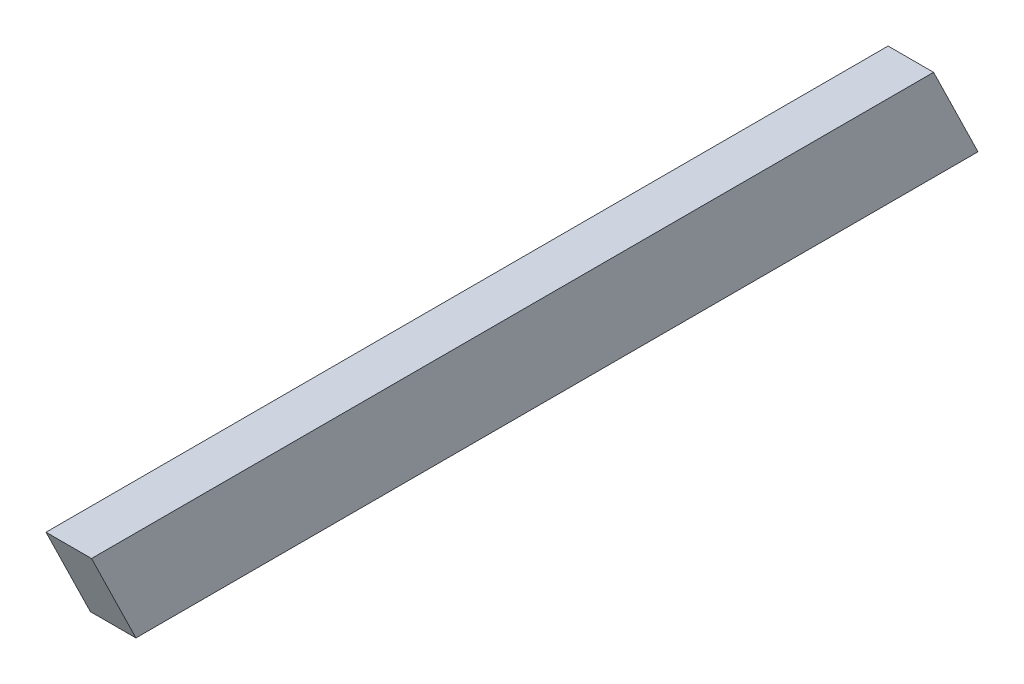
ISO-10303-21;
HEADER;
FILE_DESCRIPTION(('STEP AP214'),'2;1');
FILE_NAME('part.step','',(''),(''),'','','');
FILE_SCHEMA(('AUTOMOTIVE_DESIGN { 1 0 10303 214 1 1 1 1 }'));
ENDSEC;
DATA;
#1=APPLICATION_CONTEXT('core data for automotive mechanical design processes');
#2=APPLICATION_PROTOCOL_DEFINITION('international standard','automotive_design',2000,#1);
#3=PRODUCT_CONTEXT('',#1,'mechanical');
#4=PRODUCT('Part','Part','',(#3));
#5=PRODUCT_RELATED_PRODUCT_CATEGORY('part','',(#4));
#6=PRODUCT_DEFINITION_FORMATION('','',#4);
#7=PRODUCT_DEFINITION_CONTEXT('part definition',#1,'design');
#8=PRODUCT_DEFINITION('design','',#6,#7);
#9=PRODUCT_DEFINITION_SHAPE('','',#8);
#10=(LENGTH_UNIT() NAMED_UNIT(*) SI_UNIT(.MILLI.,.METRE.));
#11=(NAMED_UNIT(*) PLANE_ANGLE_UNIT() SI_UNIT($,.RADIAN.));
#12=(NAMED_UNIT(*) SI_UNIT($,.STERADIAN.) SOLID_ANGLE_UNIT());
#13=UNCERTAINTY_MEASURE_WITH_UNIT(LENGTH_MEASURE(1.E-05),#10,'distance_accuracy_value','');
#14=(GEOMETRIC_REPRESENTATION_CONTEXT(3) GLOBAL_UNCERTAINTY_ASSIGNED_CONTEXT((#13)) GLOBAL_UNIT_ASSIGNED_CONTEXT((#10,
#11,#12)) REPRESENTATION_CONTEXT('',''));
#15=CARTESIAN_POINT('',(0.,0.,0.));
#16=DIRECTION('',(0.,0.,1.));
#17=DIRECTION('',(1.,0.,0.));
#18=AXIS2_PLACEMENT_3D('',#15,#16,#17);
#19=CARTESIAN_POINT('',(20.,-154.795204883154,82.9133208002237));
#20=DIRECTION('',(0.,-0.438371146789082,0.898794046299165));
#21=DIRECTION('',(0.,-0.898794046299165,-0.438371146789082));
#22=AXIS2_PLACEMENT_3D('',#19,#20,#21);
#23=PLANE('',#22);
#24=DIRECTION('',(0.,0.898794046299165,0.438371146789082));
#25=VECTOR('',#24,1.);
#26=CARTESIAN_POINT('',(0.,-154.795204883154,82.9133208002237));
#27=LINE('',#26,#25);
#28=CARTESIAN_POINT('',(0.,-154.795204883154,82.9133208002237));
#29=VERTEX_POINT('',#28);
#30=CARTESIAN_POINT('',(0.,-114.795204883154,102.422624342858));
#31=VERTEX_POINT('',#30);
#32=EDGE_CURVE('E96',#29,#31,#27,.T.);
#33=ORIENTED_EDGE('',*,*,#32,.T.);
#34=DIRECTION('',(-1.,0.,0.));
#35=VECTOR('',#34,1.);
#36=CARTESIAN_POINT('',(20.,-114.795204883154,102.422624342858));
#37=LINE('',#36,#35);
#38=CARTESIAN_POINT('',(20.,-114.795204883154,102.422624342858));
#39=VERTEX_POINT('',#38);
#40=EDGE_CURVE('E11',#39,#31,#37,.T.);
#41=ORIENTED_EDGE('',*,*,#40,.F.);
#42=DIRECTION('',(0.,0.898794046299165,0.438371146789082));
#43=VECTOR('',#42,1.);
#44=CARTESIAN_POINT('',(20.,-154.795204883154,82.9133208002237));
#45=LINE('',#44,#43);
#46=CARTESIAN_POINT('',(20.,-154.795204883154,82.9133208002237));
#47=VERTEX_POINT('',#46);
#48=EDGE_CURVE('E84',#47,#39,#45,.T.);
#49=ORIENTED_EDGE('',*,*,#48,.F.);
#50=DIRECTION('',(-1.,0.,0.));
#51=VECTOR('',#50,1.);
#52=CARTESIAN_POINT('',(20.,-154.795204883154,82.9133208002237));
#53=LINE('',#52,#51);
#54=EDGE_CURVE('E92',#47,#29,#53,.T.);
#55=ORIENTED_EDGE('',*,*,#54,.T.);
#56=EDGE_LOOP('',(#33,#41,#49,#55));
#57=FACE_BOUND('',#56,.T.);
#58=ADVANCED_FACE('F33',(#57),#23,.F.);
#59=CARTESIAN_POINT('',(20.,-114.795204883154,102.422624342858));
#60=DIRECTION('',(0.,-1.,0.));
#61=DIRECTION('',(0.,0.,-1.));
#62=AXIS2_PLACEMENT_3D('',#59,#60,#61);
#63=PLANE('',#62);
#64=DIRECTION('',(0.,0.,1.));
#65=VECTOR('',#64,1.);
#66=CARTESIAN_POINT('',(0.,-114.795204883154,102.422624342858));
#67=LINE('',#66,#65);
#68=CARTESIAN_POINT('',(0.,-114.795204883155,472.422624342858));
#69=VERTEX_POINT('',#68);
#70=EDGE_CURVE('E88',#31,#69,#67,.T.);
#71=ORIENTED_EDGE('',*,*,#70,.T.);
#72=DIRECTION('',(-1.,0.,0.));
#73=VECTOR('',#72,1.);
#74=CARTESIAN_POINT('',(20.,-114.795204883155,472.422624342858));
#75=LINE('',#74,#73);
#76=CARTESIAN_POINT('',(20.,-114.795204883155,472.422624342858));
#77=VERTEX_POINT('',#76);
#78=EDGE_CURVE('E41',#77,#69,#75,.T.);
#79=ORIENTED_EDGE('',*,*,#78,.F.);
#80=DIRECTION('',(0.,0.,1.));
#81=VECTOR('',#80,1.);
#82=CARTESIAN_POINT('',(20.,-114.795204883154,102.422624342858));
#83=LINE('',#82,#81);
#84=EDGE_CURVE('E79',#39,#77,#83,.T.);
#85=ORIENTED_EDGE('',*,*,#84,.F.);
#86=ORIENTED_EDGE('',*,*,#40,.T.);
#87=EDGE_LOOP('',(#71,#79,#85,#86));
#88=FACE_BOUND('',#87,.T.);
#89=ADVANCED_FACE('F87',(#88),#63,.F.);
#90=CARTESIAN_POINT('',(20.,-114.795204883155,472.422624342858));
#91=DIRECTION('',(0.,0.438371146789082,-0.898794046299165));
#92=DIRECTION('',(0.,0.898794046299165,0.438371146789082));
#93=AXIS2_PLACEMENT_3D('',#90,#91,#92);
#94=PLANE('',#93);
#95=DIRECTION('',(0.,-0.898794046299165,-0.438371146789082));
#96=VECTOR('',#95,1.);
#97=CARTESIAN_POINT('',(0.,-114.795204883155,472.422624342858));
#98=LINE('',#97,#96);
#99=CARTESIAN_POINT('',(0.,-154.795204883155,452.913320800224));
#100=VERTEX_POINT('',#99);
#101=EDGE_CURVE('E66',#69,#100,#98,.T.);
#102=ORIENTED_EDGE('',*,*,#101,.T.);
#103=DIRECTION('',(-1.,0.,0.));
#104=VECTOR('',#103,1.);
#105=CARTESIAN_POINT('',(20.,-154.795204883155,452.913320800224));
#106=LINE('',#105,#104);
#107=CARTESIAN_POINT('',(20.,-154.795204883155,452.913320800224));
#108=VERTEX_POINT('',#107);
#109=EDGE_CURVE('E89',#108,#100,#106,.T.);
#110=ORIENTED_EDGE('',*,*,#109,.F.);
#111=DIRECTION('',(0.,-0.898794046299165,-0.438371146789082));
#112=VECTOR('',#111,1.);
#113=CARTESIAN_POINT('',(20.,-114.795204883155,472.422624342858));
#114=LINE('',#113,#112);
#115=EDGE_CURVE('E82',#77,#108,#114,.T.);
#116=ORIENTED_EDGE('',*,*,#115,.F.);
#117=ORIENTED_EDGE('',*,*,#78,.T.);
#118=EDGE_LOOP('',(#102,#110,#116,#117));
#119=FACE_BOUND('',#118,.T.);
#120=ADVANCED_FACE('F90',(#119),#94,.F.);
#121=CARTESIAN_POINT('',(20.,-154.795204883154,82.9133208002237));
#122=DIRECTION('',(0.,1.,0.));
#123=DIRECTION('',(0.,0.,1.));
#124=AXIS2_PLACEMENT_3D('',#121,#122,#123);
#125=PLANE('',#124);
#126=DIRECTION('',(0.,0.,-1.));
#127=VECTOR('',#126,1.);
#128=CARTESIAN_POINT('',(0.,-154.795204883154,82.9133208002237));
#129=LINE('',#128,#127);
#130=EDGE_CURVE('E72',#100,#29,#129,.T.);
#131=ORIENTED_EDGE('',*,*,#130,.T.);
#132=ORIENTED_EDGE('',*,*,#54,.F.);
#133=DIRECTION('',(0.,0.,-1.));
#134=VECTOR('',#133,1.);
#135=CARTESIAN_POINT('',(20.,-154.795204883154,82.9133208002237));
#136=LINE('',#135,#134);
#137=EDGE_CURVE('E49',#108,#47,#136,.T.);
#138=ORIENTED_EDGE('',*,*,#137,.F.);
#139=ORIENTED_EDGE('',*,*,#109,.T.);
#140=EDGE_LOOP('',(#131,#132,#138,#139));
#141=FACE_BOUND('',#140,.T.);
#142=ADVANCED_FACE('F103',(#141),#125,.F.);
#143=CARTESIAN_POINT('',(20.,0.,0.));
#144=DIRECTION('',(1.,0.,0.));
#145=DIRECTION('',(0.,0.,-1.));
#146=AXIS2_PLACEMENT_3D('',#143,#144,#145);
#147=PLANE('',#146);
#148=ORIENTED_EDGE('',*,*,#48,.T.);
#149=ORIENTED_EDGE('',*,*,#84,.T.);
#150=ORIENTED_EDGE('',*,*,#115,.T.);
#151=ORIENTED_EDGE('',*,*,#137,.T.);
#152=EDGE_LOOP('',(#148,#149,#150,#151));
#153=FACE_BOUND('',#152,.T.);
#154=ADVANCED_FACE('F80',(#153),#147,.T.);
#155=CARTESIAN_POINT('',(0.,0.,0.));
#156=DIRECTION('',(1.,0.,0.));
#157=DIRECTION('',(0.,0.,-1.));
#158=AXIS2_PLACEMENT_3D('',#155,#156,#157);
#159=PLANE('',#158);
#160=ORIENTED_EDGE('',*,*,#32,.F.);
#161=ORIENTED_EDGE('',*,*,#130,.F.);
#162=ORIENTED_EDGE('',*,*,#101,.F.);
#163=ORIENTED_EDGE('',*,*,#70,.F.);
#164=EDGE_LOOP('',(#160,#161,#162,#163));
#165=FACE_BOUND('',#164,.T.);
#166=ADVANCED_FACE('F106',(#165),#159,.F.);
#167=CLOSED_SHELL('',(#58,#89,#120,#142,#154,#166));
#168=MANIFOLD_SOLID_BREP('B2',#167);
#169=ADVANCED_BREP_SHAPE_REPRESENTATION('',(#18,#168),#14);
#170=SHAPE_DEFINITION_REPRESENTATION(#9,#169);
ENDSEC;
END-ISO-10303-21;
